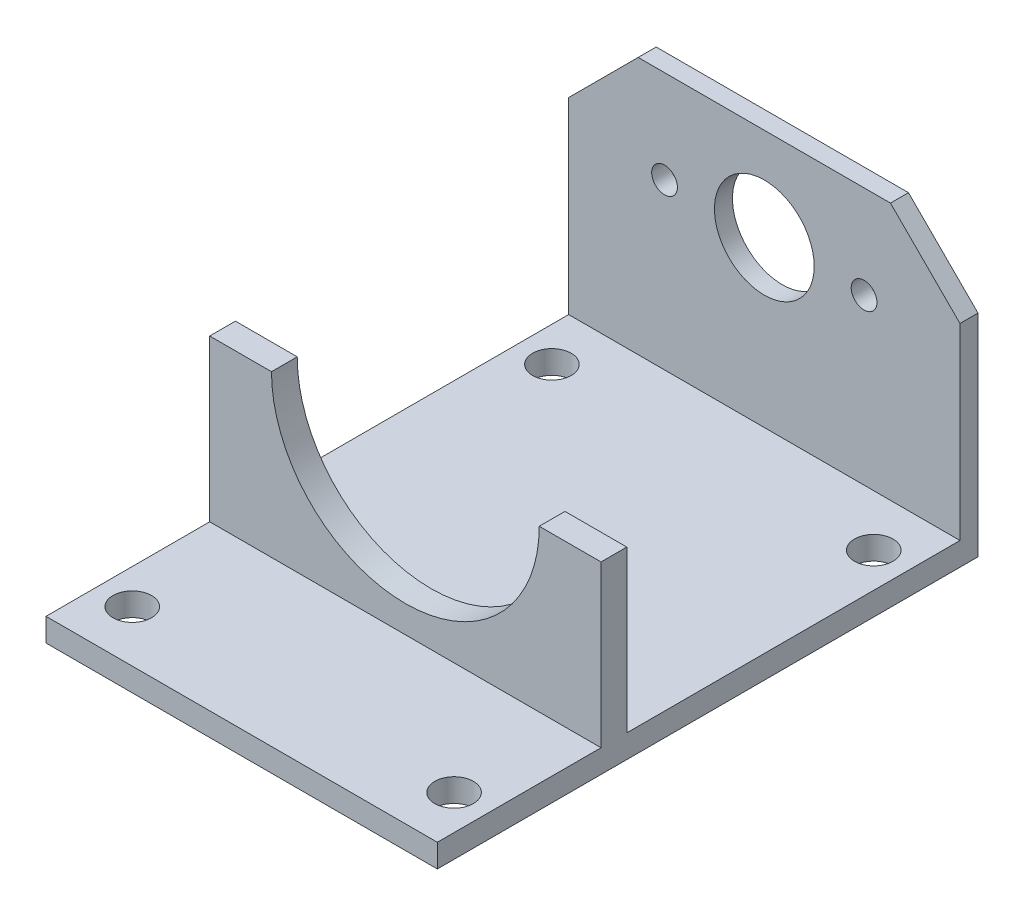
ISO-10303-21;
HEADER;
FILE_DESCRIPTION(('STEP AP214'),'2;1');
FILE_NAME('part.step','',(''),(''),'','','');
FILE_SCHEMA(('AUTOMOTIVE_DESIGN { 1 0 10303 214 1 1 1 1 }'));
ENDSEC;
DATA;
#1=APPLICATION_CONTEXT('core data for automotive mechanical design processes');
#2=APPLICATION_PROTOCOL_DEFINITION('international standard','automotive_design',2000,#1);
#3=PRODUCT_CONTEXT('',#1,'mechanical');
#4=PRODUCT('Part','Part','',(#3));
#5=PRODUCT_RELATED_PRODUCT_CATEGORY('part','',(#4));
#6=PRODUCT_DEFINITION_FORMATION('','',#4);
#7=PRODUCT_DEFINITION_CONTEXT('part definition',#1,'design');
#8=PRODUCT_DEFINITION('design','',#6,#7);
#9=PRODUCT_DEFINITION_SHAPE('','',#8);
#10=(LENGTH_UNIT() NAMED_UNIT(*) SI_UNIT(.MILLI.,.METRE.));
#11=(NAMED_UNIT(*) PLANE_ANGLE_UNIT() SI_UNIT($,.RADIAN.));
#12=(NAMED_UNIT(*) SI_UNIT($,.STERADIAN.) SOLID_ANGLE_UNIT());
#13=UNCERTAINTY_MEASURE_WITH_UNIT(LENGTH_MEASURE(1.E-05),#10,'distance_accuracy_value','');
#14=(GEOMETRIC_REPRESENTATION_CONTEXT(3) GLOBAL_UNCERTAINTY_ASSIGNED_CONTEXT((#13)) GLOBAL_UNIT_ASSIGNED_CONTEXT((#10,
#11,#12)) REPRESENTATION_CONTEXT('',''));
#15=CARTESIAN_POINT('',(0.,0.,0.));
#16=DIRECTION('',(0.,0.,1.));
#17=DIRECTION('',(1.,0.,0.));
#18=AXIS2_PLACEMENT_3D('',#15,#16,#17);
#19=CARTESIAN_POINT('',(0.,14.3,0.));
#20=DIRECTION('',(0.,1.,0.));
#21=DIRECTION('',(0.,0.,1.));
#22=AXIS2_PLACEMENT_3D('',#19,#20,#21);
#23=PLANE('',#22);
#24=DIRECTION('',(0.,0.,1.));
#25=VECTOR('',#24,1.);
#26=CARTESIAN_POINT('',(-10.4,14.3,-1.71625303385541));
#27=LINE('',#26,#25);
#28=CARTESIAN_POINT('',(-10.4,14.3,6.28374696614459));
#29=VERTEX_POINT('',#28);
#30=CARTESIAN_POINT('',(-10.4,14.3,8.28374696614459));
#31=VERTEX_POINT('',#30);
#32=EDGE_CURVE('E11',#29,#31,#27,.T.);
#33=ORIENTED_EDGE('',*,*,#32,.F.);
#34=DIRECTION('',(-1.,0.,0.));
#35=VECTOR('',#34,1.);
#36=CARTESIAN_POINT('',(15.2,14.3,6.28374696614459));
#37=LINE('',#36,#35);
#38=CARTESIAN_POINT('',(-15.2,14.3,6.28374696614459));
#39=VERTEX_POINT('',#38);
#40=EDGE_CURVE('E274',#29,#39,#37,.T.);
#41=ORIENTED_EDGE('',*,*,#40,.T.);
#42=DIRECTION('',(0.,0.,1.));
#43=VECTOR('',#42,1.);
#44=CARTESIAN_POINT('',(-15.2,14.3,8.28374696614459));
#45=LINE('',#44,#43);
#46=CARTESIAN_POINT('',(-15.2,14.3,8.28374696614459));
#47=VERTEX_POINT('',#46);
#48=EDGE_CURVE('E144',#39,#47,#45,.T.);
#49=ORIENTED_EDGE('',*,*,#48,.T.);
#50=DIRECTION('',(1.,0.,0.));
#51=VECTOR('',#50,1.);
#52=CARTESIAN_POINT('',(15.2,14.3,8.28374696614459));
#53=LINE('',#52,#51);
#54=EDGE_CURVE('E139',#47,#31,#53,.T.);
#55=ORIENTED_EDGE('',*,*,#54,.T.);
#56=EDGE_LOOP('',(#33,#41,#49,#55));
#57=FACE_BOUND('',#56,.T.);
#58=ADVANCED_FACE('F32',(#57),#23,.T.);
#59=CARTESIAN_POINT('',(0.,1.8,0.));
#60=DIRECTION('',(0.,1.,0.));
#61=DIRECTION('',(0.,0.,1.));
#62=AXIS2_PLACEMENT_3D('',#59,#60,#61);
#63=PLANE('',#62);
#64=CARTESIAN_POINT('',(-12.5,1.8,-15.6));
#65=DIRECTION('',(0.,1.,0.));
#66=DIRECTION('',(0.,0.,1.));
#67=AXIS2_PLACEMENT_3D('',#64,#65,#66);
#68=CIRCLE('',#67,1.5);
#69=CARTESIAN_POINT('',(-12.5,1.8,-14.1));
#70=VERTEX_POINT('',#69);
#71=EDGE_CURVE('E197',#70,#70,#68,.T.);
#72=ORIENTED_EDGE('',*,*,#71,.F.);
#73=EDGE_LOOP('',(#72));
#74=FACE_BOUND('',#73,.T.);
#75=CARTESIAN_POINT('',(12.5,1.8,-15.6));
#76=DIRECTION('',(0.,1.,0.));
#77=DIRECTION('',(0.,0.,1.));
#78=AXIS2_PLACEMENT_3D('',#75,#76,#77);
#79=CIRCLE('',#78,1.5);
#80=CARTESIAN_POINT('',(12.5,1.8,-14.1));
#81=VERTEX_POINT('',#80);
#82=EDGE_CURVE('E200',#81,#81,#79,.T.);
#83=ORIENTED_EDGE('',*,*,#82,.F.);
#84=EDGE_LOOP('',(#83));
#85=FACE_BOUND('',#84,.T.);
#86=DIRECTION('',(0.,0.,1.));
#87=VECTOR('',#86,1.);
#88=CARTESIAN_POINT('',(-15.2,1.8,-21.));
#89=LINE('',#88,#87);
#90=CARTESIAN_POINT('',(-15.2,1.8,-19.6));
#91=VERTEX_POINT('',#90);
#92=CARTESIAN_POINT('',(-15.2,1.8,6.28374696614459));
#93=VERTEX_POINT('',#92);
#94=EDGE_CURVE('E230',#91,#93,#89,.T.);
#95=ORIENTED_EDGE('',*,*,#94,.T.);
#96=DIRECTION('',(-1.,0.,0.));
#97=VECTOR('',#96,1.);
#98=CARTESIAN_POINT('',(15.2,1.8,6.28374696614459));
#99=LINE('',#98,#97);
#100=CARTESIAN_POINT('',(15.2,1.8,6.28374696614459));
#101=VERTEX_POINT('',#100);
#102=EDGE_CURVE('E152',#101,#93,#99,.T.);
#103=ORIENTED_EDGE('',*,*,#102,.F.);
#104=DIRECTION('',(0.,0.,-1.));
#105=VECTOR('',#104,1.);
#106=CARTESIAN_POINT('',(15.2,1.8,-21.));
#107=LINE('',#106,#105);
#108=CARTESIAN_POINT('',(15.2,1.8,-19.6));
#109=VERTEX_POINT('',#108);
#110=EDGE_CURVE('E229',#101,#109,#107,.T.);
#111=ORIENTED_EDGE('',*,*,#110,.T.);
#112=DIRECTION('',(1.,0.,0.));
#113=VECTOR('',#112,1.);
#114=CARTESIAN_POINT('',(-15.2,1.8,-19.6));
#115=LINE('',#114,#113);
#116=EDGE_CURVE('E215',#91,#109,#115,.T.);
#117=ORIENTED_EDGE('',*,*,#116,.F.);
#118=EDGE_LOOP('',(#95,#103,#111,#117));
#119=FACE_BOUND('',#118,.T.);
#120=ADVANCED_FACE('F296',(#74,#85,#119),#63,.T.);
#121=CARTESIAN_POINT('',(-12.5,1.8,17.));
#122=DIRECTION('',(0.,1.,0.));
#123=DIRECTION('',(0.,0.,1.));
#124=AXIS2_PLACEMENT_3D('',#121,#122,#123);
#125=CIRCLE('',#124,1.5);
#126=CARTESIAN_POINT('',(-12.5,1.8,18.5));
#127=VERTEX_POINT('',#126);
#128=EDGE_CURVE('E206',#127,#127,#125,.T.);
#129=ORIENTED_EDGE('',*,*,#128,.F.);
#130=EDGE_LOOP('',(#129));
#131=FACE_BOUND('',#130,.T.);
#132=CARTESIAN_POINT('',(12.5,1.8,17.));
#133=DIRECTION('',(0.,1.,0.));
#134=DIRECTION('',(0.,0.,1.));
#135=AXIS2_PLACEMENT_3D('',#132,#133,#134);
#136=CIRCLE('',#135,1.5);
#137=CARTESIAN_POINT('',(12.5,1.8,18.5));
#138=VERTEX_POINT('',#137);
#139=EDGE_CURVE('E196',#138,#138,#136,.T.);
#140=ORIENTED_EDGE('',*,*,#139,.F.);
#141=EDGE_LOOP('',(#140));
#142=FACE_BOUND('',#141,.T.);
#143=CARTESIAN_POINT('',(15.2,1.8,21.));
#144=VERTEX_POINT('',#143);
#145=CARTESIAN_POINT('',(15.2,1.8,8.28374696614459));
#146=VERTEX_POINT('',#145);
#147=EDGE_CURVE('E225',#144,#146,#107,.T.);
#148=ORIENTED_EDGE('',*,*,#147,.T.);
#149=DIRECTION('',(1.,0.,0.));
#150=VECTOR('',#149,1.);
#151=CARTESIAN_POINT('',(15.2,1.8,8.28374696614459));
#152=LINE('',#151,#150);
#153=CARTESIAN_POINT('',(-15.2,1.8,8.28374696614458));
#154=VERTEX_POINT('',#153);
#155=EDGE_CURVE('E154',#154,#146,#152,.T.);
#156=ORIENTED_EDGE('',*,*,#155,.F.);
#157=CARTESIAN_POINT('',(-15.2,1.8,21.));
#158=VERTEX_POINT('',#157);
#159=EDGE_CURVE('E228',#154,#158,#89,.T.);
#160=ORIENTED_EDGE('',*,*,#159,.T.);
#161=DIRECTION('',(1.,0.,0.));
#162=VECTOR('',#161,1.);
#163=CARTESIAN_POINT('',(-15.2,1.8,21.));
#164=LINE('',#163,#162);
#165=EDGE_CURVE('E233',#158,#144,#164,.T.);
#166=ORIENTED_EDGE('',*,*,#165,.T.);
#167=EDGE_LOOP('',(#148,#156,#160,#166));
#168=FACE_BOUND('',#167,.T.);
#169=ADVANCED_FACE('F289',(#131,#142,#168),#63,.T.);
#170=CARTESIAN_POINT('',(15.2,1.8,-21.));
#171=DIRECTION('',(-1.,0.,0.));
#172=DIRECTION('',(0.,0.,1.));
#173=AXIS2_PLACEMENT_3D('',#170,#171,#172);
#174=PLANE('',#173);
#175=DIRECTION('',(0.,-1.,0.));
#176=VECTOR('',#175,1.);
#177=CARTESIAN_POINT('',(15.2,1.8,-21.));
#178=LINE('',#177,#176);
#179=CARTESIAN_POINT('',(15.2,16.4,-21.));
#180=VERTEX_POINT('',#179);
#181=CARTESIAN_POINT('',(15.2,0.,-21.));
#182=VERTEX_POINT('',#181);
#183=EDGE_CURVE('E252',#180,#182,#178,.T.);
#184=ORIENTED_EDGE('',*,*,#183,.F.);
#185=DIRECTION('',(0.,0.,1.));
#186=VECTOR('',#185,1.);
#187=CARTESIAN_POINT('',(15.2,16.4,-39.6));
#188=LINE('',#187,#186);
#189=CARTESIAN_POINT('',(15.2,16.4,-19.6));
#190=VERTEX_POINT('',#189);
#191=EDGE_CURVE('E172',#180,#190,#188,.T.);
#192=ORIENTED_EDGE('',*,*,#191,.T.);
#193=DIRECTION('',(0.,-1.,0.));
#194=VECTOR('',#193,1.);
#195=CARTESIAN_POINT('',(15.2,21.8,-19.6));
#196=LINE('',#195,#194);
#197=EDGE_CURVE('E217',#190,#109,#196,.T.);
#198=ORIENTED_EDGE('',*,*,#197,.T.);
#199=ORIENTED_EDGE('',*,*,#110,.F.);
#200=DIRECTION('',(0.,-1.,0.));
#201=VECTOR('',#200,1.);
#202=CARTESIAN_POINT('',(15.2,14.3,6.28374696614459));
#203=LINE('',#202,#201);
#204=CARTESIAN_POINT('',(15.2,14.3,6.28374696614459));
#205=VERTEX_POINT('',#204);
#206=EDGE_CURVE('E161',#205,#101,#203,.T.);
#207=ORIENTED_EDGE('',*,*,#206,.F.);
#208=DIRECTION('',(0.,0.,-1.));
#209=VECTOR('',#208,1.);
#210=CARTESIAN_POINT('',(15.2,14.3,8.28374696614459));
#211=LINE('',#210,#209);
#212=CARTESIAN_POINT('',(15.2,14.3,8.28374696614459));
#213=VERTEX_POINT('',#212);
#214=EDGE_CURVE('E155',#213,#205,#211,.T.);
#215=ORIENTED_EDGE('',*,*,#214,.F.);
#216=DIRECTION('',(0.,-1.,0.));
#217=VECTOR('',#216,1.);
#218=CARTESIAN_POINT('',(15.2,14.3,8.28374696614459));
#219=LINE('',#218,#217);
#220=EDGE_CURVE('E145',#213,#146,#219,.T.);
#221=ORIENTED_EDGE('',*,*,#220,.T.);
#222=ORIENTED_EDGE('',*,*,#147,.F.);
#223=DIRECTION('',(0.,-1.,0.));
#224=VECTOR('',#223,1.);
#225=CARTESIAN_POINT('',(15.2,1.8,21.));
#226=LINE('',#225,#224);
#227=CARTESIAN_POINT('',(15.2,0.,21.));
#228=VERTEX_POINT('',#227);
#229=EDGE_CURVE('E235',#144,#228,#226,.T.);
#230=ORIENTED_EDGE('',*,*,#229,.T.);
#231=DIRECTION('',(0.,0.,-1.));
#232=VECTOR('',#231,1.);
#233=CARTESIAN_POINT('',(15.2,0.,-21.));
#234=LINE('',#233,#232);
#235=EDGE_CURVE('E224',#228,#182,#234,.T.);
#236=ORIENTED_EDGE('',*,*,#235,.T.);
#237=EDGE_LOOP('',(#184,#192,#198,#199,#207,#215,#221,#222,#230,#236));
#238=FACE_BOUND('',#237,.T.);
#239=ADVANCED_FACE('F34',(#238),#174,.F.);
#240=CARTESIAN_POINT('',(-15.2,1.8,-21.));
#241=DIRECTION('',(0.,0.,1.));
#242=DIRECTION('',(1.,0.,0.));
#243=AXIS2_PLACEMENT_3D('',#240,#241,#242);
#244=PLANE('',#243);
#245=CARTESIAN_POINT('',(7.75,14.58,-21.));
#246=DIRECTION('',(0.,0.,1.));
#247=DIRECTION('',(1.,0.,0.));
#248=AXIS2_PLACEMENT_3D('',#245,#246,#247);
#249=CIRCLE('',#248,1.);
#250=CARTESIAN_POINT('',(8.75,14.58,-21.));
#251=VERTEX_POINT('',#250);
#252=EDGE_CURVE('E186',#251,#251,#249,.T.);
#253=ORIENTED_EDGE('',*,*,#252,.T.);
#254=EDGE_LOOP('',(#253));
#255=FACE_BOUND('',#254,.T.);
#256=CARTESIAN_POINT('',(-7.75,14.58,-21.));
#257=DIRECTION('',(0.,0.,1.));
#258=DIRECTION('',(1.,0.,0.));
#259=AXIS2_PLACEMENT_3D('',#256,#257,#258);
#260=CIRCLE('',#259,1.);
#261=CARTESIAN_POINT('',(-6.75,14.58,-21.));
#262=VERTEX_POINT('',#261);
#263=EDGE_CURVE('E183',#262,#262,#260,.T.);
#264=ORIENTED_EDGE('',*,*,#263,.T.);
#265=EDGE_LOOP('',(#264));
#266=FACE_BOUND('',#265,.T.);
#267=CARTESIAN_POINT('',(0.,14.58,-21.));
#268=DIRECTION('',(0.,0.,1.));
#269=DIRECTION('',(1.,0.,0.));
#270=AXIS2_PLACEMENT_3D('',#267,#268,#269);
#271=CIRCLE('',#270,3.875);
#272=CARTESIAN_POINT('',(3.875,14.58,-21.));
#273=VERTEX_POINT('',#272);
#274=EDGE_CURVE('E180',#273,#273,#271,.T.);
#275=ORIENTED_EDGE('',*,*,#274,.T.);
#276=EDGE_LOOP('',(#275));
#277=FACE_BOUND('',#276,.T.);
#278=DIRECTION('',(-1.,0.,0.));
#279=VECTOR('',#278,1.);
#280=CARTESIAN_POINT('',(-15.2,21.8,-21.));
#281=LINE('',#280,#279);
#282=CARTESIAN_POINT('',(9.8,21.8,-21.));
#283=VERTEX_POINT('',#282);
#284=CARTESIAN_POINT('',(-9.8,21.8,-21.));
#285=VERTEX_POINT('',#284);
#286=EDGE_CURVE('E214',#283,#285,#281,.T.);
#287=ORIENTED_EDGE('',*,*,#286,.F.);
#288=DIRECTION('',(0.707106781186547,-0.707106781186548,0.));
#289=VECTOR('',#288,1.);
#290=CARTESIAN_POINT('',(7.3,24.3,-21.));
#291=LINE('',#290,#289);
#292=EDGE_CURVE('E175',#283,#180,#291,.T.);
#293=ORIENTED_EDGE('',*,*,#292,.T.);
#294=ORIENTED_EDGE('',*,*,#183,.T.);
#295=DIRECTION('',(-1.,0.,0.));
#296=VECTOR('',#295,1.);
#297=CARTESIAN_POINT('',(-15.2,0.,-21.));
#298=LINE('',#297,#296);
#299=CARTESIAN_POINT('',(-15.2,0.,-21.));
#300=VERTEX_POINT('',#299);
#301=EDGE_CURVE('E238',#182,#300,#298,.T.);
#302=ORIENTED_EDGE('',*,*,#301,.T.);
#303=DIRECTION('',(0.,-1.,0.));
#304=VECTOR('',#303,1.);
#305=CARTESIAN_POINT('',(-15.2,1.8,-21.));
#306=LINE('',#305,#304);
#307=CARTESIAN_POINT('',(-15.2,16.4,-21.));
#308=VERTEX_POINT('',#307);
#309=EDGE_CURVE('E250',#308,#300,#306,.T.);
#310=ORIENTED_EDGE('',*,*,#309,.F.);
#311=DIRECTION('',(0.707106781186547,0.707106781186548,0.));
#312=VECTOR('',#311,1.);
#313=CARTESIAN_POINT('',(-22.5,9.1,-21.));
#314=LINE('',#313,#312);
#315=EDGE_CURVE('E193',#308,#285,#314,.T.);
#316=ORIENTED_EDGE('',*,*,#315,.T.);
#317=EDGE_LOOP('',(#287,#293,#294,#302,#310,#316));
#318=FACE_BOUND('',#317,.T.);
#319=ADVANCED_FACE('F314',(#255,#266,#277,#318),#244,.F.);
#320=CARTESIAN_POINT('',(-15.2,1.8,-21.));
#321=DIRECTION('',(1.,0.,0.));
#322=DIRECTION('',(0.,0.,-1.));
#323=AXIS2_PLACEMENT_3D('',#320,#321,#322);
#324=PLANE('',#323);
#325=DIRECTION('',(0.,-1.,0.));
#326=VECTOR('',#325,1.);
#327=CARTESIAN_POINT('',(-15.2,21.8,-19.6));
#328=LINE('',#327,#326);
#329=CARTESIAN_POINT('',(-15.2,16.4,-19.6));
#330=VERTEX_POINT('',#329);
#331=EDGE_CURVE('E222',#330,#91,#328,.T.);
#332=ORIENTED_EDGE('',*,*,#331,.F.);
#333=DIRECTION('',(0.,0.,1.));
#334=VECTOR('',#333,1.);
#335=CARTESIAN_POINT('',(-15.2,16.4,-39.6));
#336=LINE('',#335,#334);
#337=EDGE_CURVE('E191',#308,#330,#336,.T.);
#338=ORIENTED_EDGE('',*,*,#337,.F.);
#339=ORIENTED_EDGE('',*,*,#309,.T.);
#340=DIRECTION('',(0.,0.,1.));
#341=VECTOR('',#340,1.);
#342=CARTESIAN_POINT('',(-15.2,0.,-21.));
#343=LINE('',#342,#341);
#344=CARTESIAN_POINT('',(-15.2,0.,21.));
#345=VERTEX_POINT('',#344);
#346=EDGE_CURVE('E241',#300,#345,#343,.T.);
#347=ORIENTED_EDGE('',*,*,#346,.T.);
#348=DIRECTION('',(0.,-1.,0.));
#349=VECTOR('',#348,1.);
#350=CARTESIAN_POINT('',(-15.2,1.8,21.));
#351=LINE('',#350,#349);
#352=EDGE_CURVE('E247',#158,#345,#351,.T.);
#353=ORIENTED_EDGE('',*,*,#352,.F.);
#354=ORIENTED_EDGE('',*,*,#159,.F.);
#355=DIRECTION('',(0.,-1.,0.));
#356=VECTOR('',#355,1.);
#357=CARTESIAN_POINT('',(-15.2,14.3,8.28374696614459));
#358=LINE('',#357,#356);
#359=EDGE_CURVE('E54',#47,#154,#358,.T.);
#360=ORIENTED_EDGE('',*,*,#359,.F.);
#361=ORIENTED_EDGE('',*,*,#48,.F.);
#362=DIRECTION('',(0.,-1.,0.));
#363=VECTOR('',#362,1.);
#364=CARTESIAN_POINT('',(-15.2,14.3,6.28374696614459));
#365=LINE('',#364,#363);
#366=EDGE_CURVE('E158',#39,#93,#365,.T.);
#367=ORIENTED_EDGE('',*,*,#366,.T.);
#368=ORIENTED_EDGE('',*,*,#94,.F.);
#369=EDGE_LOOP('',(#332,#338,#339,#347,#353,#354,#360,#361,#367,#368));
#370=FACE_BOUND('',#369,.T.);
#371=ADVANCED_FACE('F284',(#370),#324,.F.);
#372=CARTESIAN_POINT('',(-15.2,1.8,21.));
#373=DIRECTION('',(0.,0.,-1.));
#374=DIRECTION('',(-1.,0.,0.));
#375=AXIS2_PLACEMENT_3D('',#372,#373,#374);
#376=PLANE('',#375);
#377=DIRECTION('',(1.,0.,0.));
#378=VECTOR('',#377,1.);
#379=CARTESIAN_POINT('',(-15.2,0.,21.));
#380=LINE('',#379,#378);
#381=EDGE_CURVE('E243',#345,#228,#380,.T.);
#382=ORIENTED_EDGE('',*,*,#381,.T.);
#383=ORIENTED_EDGE('',*,*,#229,.F.);
#384=ORIENTED_EDGE('',*,*,#165,.F.);
#385=ORIENTED_EDGE('',*,*,#352,.T.);
#386=EDGE_LOOP('',(#382,#383,#384,#385));
#387=FACE_BOUND('',#386,.T.);
#388=ADVANCED_FACE('F320',(#387),#376,.F.);
#389=CARTESIAN_POINT('',(0.,0.,0.));
#390=DIRECTION('',(0.,1.,0.));
#391=DIRECTION('',(0.,0.,1.));
#392=AXIS2_PLACEMENT_3D('',#389,#390,#391);
#393=PLANE('',#392);
#394=CARTESIAN_POINT('',(12.5,0.,17.));
#395=DIRECTION('',(0.,1.,0.));
#396=DIRECTION('',(0.,0.,1.));
#397=AXIS2_PLACEMENT_3D('',#394,#395,#396);
#398=CIRCLE('',#397,1.5);
#399=CARTESIAN_POINT('',(12.5,0.,18.5));
#400=VERTEX_POINT('',#399);
#401=EDGE_CURVE('E210',#400,#400,#398,.T.);
#402=ORIENTED_EDGE('',*,*,#401,.T.);
#403=EDGE_LOOP('',(#402));
#404=FACE_BOUND('',#403,.T.);
#405=CARTESIAN_POINT('',(-12.5,0.,-15.6));
#406=DIRECTION('',(0.,1.,0.));
#407=DIRECTION('',(0.,0.,1.));
#408=AXIS2_PLACEMENT_3D('',#405,#406,#407);
#409=CIRCLE('',#408,1.5);
#410=CARTESIAN_POINT('',(-12.5,0.,-14.1));
#411=VERTEX_POINT('',#410);
#412=EDGE_CURVE('E259',#411,#411,#409,.T.);
#413=ORIENTED_EDGE('',*,*,#412,.T.);
#414=EDGE_LOOP('',(#413));
#415=FACE_BOUND('',#414,.T.);
#416=CARTESIAN_POINT('',(12.5,0.,-15.6));
#417=DIRECTION('',(0.,1.,0.));
#418=DIRECTION('',(0.,0.,1.));
#419=AXIS2_PLACEMENT_3D('',#416,#417,#418);
#420=CIRCLE('',#419,1.5);
#421=CARTESIAN_POINT('',(12.5,0.,-14.1));
#422=VERTEX_POINT('',#421);
#423=EDGE_CURVE('E205',#422,#422,#420,.T.);
#424=ORIENTED_EDGE('',*,*,#423,.T.);
#425=EDGE_LOOP('',(#424));
#426=FACE_BOUND('',#425,.T.);
#427=CARTESIAN_POINT('',(-12.5,0.,17.));
#428=DIRECTION('',(0.,1.,0.));
#429=DIRECTION('',(0.,0.,1.));
#430=AXIS2_PLACEMENT_3D('',#427,#428,#429);
#431=CIRCLE('',#430,1.5);
#432=CARTESIAN_POINT('',(-12.5,0.,18.5));
#433=VERTEX_POINT('',#432);
#434=EDGE_CURVE('E209',#433,#433,#431,.T.);
#435=ORIENTED_EDGE('',*,*,#434,.T.);
#436=EDGE_LOOP('',(#435));
#437=FACE_BOUND('',#436,.T.);
#438=ORIENTED_EDGE('',*,*,#235,.F.);
#439=ORIENTED_EDGE('',*,*,#381,.F.);
#440=ORIENTED_EDGE('',*,*,#346,.F.);
#441=ORIENTED_EDGE('',*,*,#301,.F.);
#442=EDGE_LOOP('',(#438,#439,#440,#441));
#443=FACE_BOUND('',#442,.T.);
#444=ADVANCED_FACE('F322',(#404,#415,#426,#437,#443),#393,.F.);
#445=CARTESIAN_POINT('',(-15.2,21.8,-19.6));
#446=DIRECTION('',(0.,0.,-1.));
#447=DIRECTION('',(-1.,0.,0.));
#448=AXIS2_PLACEMENT_3D('',#445,#446,#447);
#449=PLANE('',#448);
#450=CARTESIAN_POINT('',(7.75,14.58,-19.6));
#451=DIRECTION('',(0.,0.,1.));
#452=DIRECTION('',(1.,0.,0.));
#453=AXIS2_PLACEMENT_3D('',#450,#451,#452);
#454=CIRCLE('',#453,1.);
#455=CARTESIAN_POINT('',(8.75,14.58,-19.6));
#456=VERTEX_POINT('',#455);
#457=EDGE_CURVE('E163',#456,#456,#454,.T.);
#458=ORIENTED_EDGE('',*,*,#457,.F.);
#459=EDGE_LOOP('',(#458));
#460=FACE_BOUND('',#459,.T.);
#461=CARTESIAN_POINT('',(-7.75,14.58,-19.6));
#462=DIRECTION('',(0.,0.,1.));
#463=DIRECTION('',(1.,0.,0.));
#464=AXIS2_PLACEMENT_3D('',#461,#462,#463);
#465=CIRCLE('',#464,1.);
#466=CARTESIAN_POINT('',(-6.75,14.58,-19.6));
#467=VERTEX_POINT('',#466);
#468=EDGE_CURVE('E164',#467,#467,#465,.T.);
#469=ORIENTED_EDGE('',*,*,#468,.F.);
#470=EDGE_LOOP('',(#469));
#471=FACE_BOUND('',#470,.T.);
#472=CARTESIAN_POINT('',(0.,14.58,-19.6));
#473=DIRECTION('',(0.,0.,1.));
#474=DIRECTION('',(1.,0.,0.));
#475=AXIS2_PLACEMENT_3D('',#472,#473,#474);
#476=CIRCLE('',#475,3.875);
#477=CARTESIAN_POINT('',(3.875,14.58,-19.6));
#478=VERTEX_POINT('',#477);
#479=EDGE_CURVE('E167',#478,#478,#476,.T.);
#480=ORIENTED_EDGE('',*,*,#479,.F.);
#481=EDGE_LOOP('',(#480));
#482=FACE_BOUND('',#481,.T.);
#483=ORIENTED_EDGE('',*,*,#197,.F.);
#484=DIRECTION('',(0.707106781186547,-0.707106781186548,0.));
#485=VECTOR('',#484,1.);
#486=CARTESIAN_POINT('',(9.8,21.8,-19.6));
#487=LINE('',#486,#485);
#488=CARTESIAN_POINT('',(9.8,21.8,-19.6));
#489=VERTEX_POINT('',#488);
#490=EDGE_CURVE('E170',#489,#190,#487,.T.);
#491=ORIENTED_EDGE('',*,*,#490,.F.);
#492=DIRECTION('',(1.,0.,0.));
#493=VECTOR('',#492,1.);
#494=CARTESIAN_POINT('',(-15.2,21.8,-19.6));
#495=LINE('',#494,#493);
#496=CARTESIAN_POINT('',(-9.8,21.8,-19.6));
#497=VERTEX_POINT('',#496);
#498=EDGE_CURVE('E211',#497,#489,#495,.T.);
#499=ORIENTED_EDGE('',*,*,#498,.F.);
#500=DIRECTION('',(0.707106781186547,0.707106781186548,0.));
#501=VECTOR('',#500,1.);
#502=CARTESIAN_POINT('',(-15.2,16.4,-19.6));
#503=LINE('',#502,#501);
#504=EDGE_CURVE('E189',#330,#497,#503,.T.);
#505=ORIENTED_EDGE('',*,*,#504,.F.);
#506=ORIENTED_EDGE('',*,*,#331,.T.);
#507=ORIENTED_EDGE('',*,*,#116,.T.);
#508=EDGE_LOOP('',(#483,#491,#499,#505,#506,#507));
#509=FACE_BOUND('',#508,.T.);
#510=ADVANCED_FACE('F303',(#460,#471,#482,#509),#449,.F.);
#511=CARTESIAN_POINT('',(0.,21.8,0.));
#512=DIRECTION('',(0.,1.,0.));
#513=DIRECTION('',(0.,0.,1.));
#514=AXIS2_PLACEMENT_3D('',#511,#512,#513);
#515=PLANE('',#514);
#516=DIRECTION('',(0.,0.,1.));
#517=VECTOR('',#516,1.);
#518=CARTESIAN_POINT('',(9.8,21.8,0.));
#519=LINE('',#518,#517);
#520=EDGE_CURVE('E266',#283,#489,#519,.T.);
#521=ORIENTED_EDGE('',*,*,#520,.F.);
#522=ORIENTED_EDGE('',*,*,#286,.T.);
#523=DIRECTION('',(0.,0.,-1.));
#524=VECTOR('',#523,1.);
#525=CARTESIAN_POINT('',(-9.8,21.8,0.));
#526=LINE('',#525,#524);
#527=EDGE_CURVE('E254',#497,#285,#526,.T.);
#528=ORIENTED_EDGE('',*,*,#527,.F.);
#529=ORIENTED_EDGE('',*,*,#498,.T.);
#530=EDGE_LOOP('',(#521,#522,#528,#529));
#531=FACE_BOUND('',#530,.T.);
#532=ADVANCED_FACE('F311',(#531),#515,.T.);
#533=CARTESIAN_POINT('',(-12.5,-18.2,17.));
#534=DIRECTION('',(0.,1.,0.));
#535=DIRECTION('',(0.,0.,1.));
#536=AXIS2_PLACEMENT_3D('',#533,#534,#535);
#537=CYLINDRICAL_SURFACE('',#536,1.5);
#538=ORIENTED_EDGE('',*,*,#128,.T.);
#539=EDGE_LOOP('',(#538));
#540=FACE_BOUND('',#539,.T.);
#541=ORIENTED_EDGE('',*,*,#434,.F.);
#542=EDGE_LOOP('',(#541));
#543=FACE_BOUND('',#542,.T.);
#544=ADVANCED_FACE('F391',(#540,#543),#537,.F.);
#545=CARTESIAN_POINT('',(12.5,-18.2,-15.6));
#546=DIRECTION('',(0.,1.,0.));
#547=DIRECTION('',(0.,0.,1.));
#548=AXIS2_PLACEMENT_3D('',#545,#546,#547);
#549=CYLINDRICAL_SURFACE('',#548,1.5);
#550=ORIENTED_EDGE('',*,*,#82,.T.);
#551=EDGE_LOOP('',(#550));
#552=FACE_BOUND('',#551,.T.);
#553=ORIENTED_EDGE('',*,*,#423,.F.);
#554=EDGE_LOOP('',(#553));
#555=FACE_BOUND('',#554,.T.);
#556=ADVANCED_FACE('F394',(#552,#555),#549,.F.);
#557=CARTESIAN_POINT('',(-12.5,-18.2,-15.6));
#558=DIRECTION('',(0.,1.,0.));
#559=DIRECTION('',(0.,0.,1.));
#560=AXIS2_PLACEMENT_3D('',#557,#558,#559);
#561=CYLINDRICAL_SURFACE('',#560,1.5);
#562=ORIENTED_EDGE('',*,*,#71,.T.);
#563=EDGE_LOOP('',(#562));
#564=FACE_BOUND('',#563,.T.);
#565=ORIENTED_EDGE('',*,*,#412,.F.);
#566=EDGE_LOOP('',(#565));
#567=FACE_BOUND('',#566,.T.);
#568=ADVANCED_FACE('F398',(#564,#567),#561,.F.);
#569=CARTESIAN_POINT('',(12.5,-18.2,17.));
#570=DIRECTION('',(0.,1.,0.));
#571=DIRECTION('',(0.,0.,1.));
#572=AXIS2_PLACEMENT_3D('',#569,#570,#571);
#573=CYLINDRICAL_SURFACE('',#572,1.5);
#574=ORIENTED_EDGE('',*,*,#139,.T.);
#575=EDGE_LOOP('',(#574));
#576=FACE_BOUND('',#575,.T.);
#577=ORIENTED_EDGE('',*,*,#401,.F.);
#578=EDGE_LOOP('',(#577));
#579=FACE_BOUND('',#578,.T.);
#580=ADVANCED_FACE('F335',(#576,#579),#573,.F.);
#581=CARTESIAN_POINT('',(-15.2,16.4,-39.6));
#582=DIRECTION('',(0.707106781186548,-0.707106781186547,0.));
#583=DIRECTION('',(0.707106781186547,0.707106781186548,0.));
#584=AXIS2_PLACEMENT_3D('',#581,#582,#583);
#585=PLANE('',#584);
#586=ORIENTED_EDGE('',*,*,#337,.T.);
#587=ORIENTED_EDGE('',*,*,#504,.T.);
#588=ORIENTED_EDGE('',*,*,#527,.T.);
#589=ORIENTED_EDGE('',*,*,#315,.F.);
#590=EDGE_LOOP('',(#586,#587,#588,#589));
#591=FACE_BOUND('',#590,.T.);
#592=ADVANCED_FACE('F308',(#591),#585,.F.);
#593=CARTESIAN_POINT('',(9.8,21.8,-39.6));
#594=DIRECTION('',(-0.707106781186548,-0.707106781186547,0.));
#595=DIRECTION('',(0.707106781186547,-0.707106781186548,0.));
#596=AXIS2_PLACEMENT_3D('',#593,#594,#595);
#597=PLANE('',#596);
#598=ORIENTED_EDGE('',*,*,#520,.T.);
#599=ORIENTED_EDGE('',*,*,#490,.T.);
#600=ORIENTED_EDGE('',*,*,#191,.F.);
#601=ORIENTED_EDGE('',*,*,#292,.F.);
#602=EDGE_LOOP('',(#598,#599,#600,#601));
#603=FACE_BOUND('',#602,.T.);
#604=ADVANCED_FACE('F324',(#603),#597,.F.);
#605=CARTESIAN_POINT('',(0.,14.58,-39.6));
#606=DIRECTION('',(0.,0.,1.));
#607=DIRECTION('',(1.,0.,0.));
#608=AXIS2_PLACEMENT_3D('',#605,#606,#607);
#609=CYLINDRICAL_SURFACE('',#608,3.875);
#610=ORIENTED_EDGE('',*,*,#479,.T.);
#611=EDGE_LOOP('',(#610));
#612=FACE_BOUND('',#611,.T.);
#613=ORIENTED_EDGE('',*,*,#274,.F.);
#614=EDGE_LOOP('',(#613));
#615=FACE_BOUND('',#614,.T.);
#616=ADVANCED_FACE('F326',(#612,#615),#609,.F.);
#617=CARTESIAN_POINT('',(-7.75,14.58,-39.6));
#618=DIRECTION('',(0.,0.,1.));
#619=DIRECTION('',(1.,0.,0.));
#620=AXIS2_PLACEMENT_3D('',#617,#618,#619);
#621=CYLINDRICAL_SURFACE('',#620,1.);
#622=ORIENTED_EDGE('',*,*,#468,.T.);
#623=EDGE_LOOP('',(#622));
#624=FACE_BOUND('',#623,.T.);
#625=ORIENTED_EDGE('',*,*,#263,.F.);
#626=EDGE_LOOP('',(#625));
#627=FACE_BOUND('',#626,.T.);
#628=ADVANCED_FACE('F332',(#624,#627),#621,.F.);
#629=CARTESIAN_POINT('',(7.75,14.58,-39.6));
#630=DIRECTION('',(0.,0.,1.));
#631=DIRECTION('',(1.,0.,0.));
#632=AXIS2_PLACEMENT_3D('',#629,#630,#631);
#633=CYLINDRICAL_SURFACE('',#632,1.);
#634=ORIENTED_EDGE('',*,*,#457,.T.);
#635=EDGE_LOOP('',(#634));
#636=FACE_BOUND('',#635,.T.);
#637=ORIENTED_EDGE('',*,*,#252,.F.);
#638=EDGE_LOOP('',(#637));
#639=FACE_BOUND('',#638,.T.);
#640=ADVANCED_FACE('F355',(#636,#639),#633,.F.);
#641=CARTESIAN_POINT('',(15.2,14.3,6.28374696614459));
#642=DIRECTION('',(0.,0.,1.));
#643=DIRECTION('',(1.,0.,0.));
#644=AXIS2_PLACEMENT_3D('',#641,#642,#643);
#645=PLANE('',#644);
#646=ORIENTED_EDGE('',*,*,#40,.F.);
#647=CARTESIAN_POINT('',(0.,14.3,6.28374696614459));
#648=DIRECTION('',(0.,0.,1.));
#649=DIRECTION('',(1.,0.,0.));
#650=AXIS2_PLACEMENT_3D('',#647,#648,#649);
#651=CIRCLE('',#650,10.4);
#652=CARTESIAN_POINT('',(10.4,14.3,6.28374696614459));
#653=VERTEX_POINT('',#652);
#654=EDGE_CURVE('E133',#29,#653,#651,.T.);
#655=ORIENTED_EDGE('',*,*,#654,.T.);
#656=EDGE_CURVE('E271',#205,#653,#37,.T.);
#657=ORIENTED_EDGE('',*,*,#656,.F.);
#658=ORIENTED_EDGE('',*,*,#206,.T.);
#659=ORIENTED_EDGE('',*,*,#102,.T.);
#660=ORIENTED_EDGE('',*,*,#366,.F.);
#661=EDGE_LOOP('',(#646,#655,#657,#658,#659,#660));
#662=FACE_BOUND('',#661,.T.);
#663=ADVANCED_FACE('F270',(#662),#645,.F.);
#664=CARTESIAN_POINT('',(15.2,14.3,8.28374696614459));
#665=DIRECTION('',(0.,0.,-1.));
#666=DIRECTION('',(-1.,0.,0.));
#667=AXIS2_PLACEMENT_3D('',#664,#665,#666);
#668=PLANE('',#667);
#669=CARTESIAN_POINT('',(10.4,14.3,8.28374696614459));
#670=VERTEX_POINT('',#669);
#671=EDGE_CURVE('E141',#670,#213,#53,.T.);
#672=ORIENTED_EDGE('',*,*,#671,.F.);
#673=CARTESIAN_POINT('',(0.,14.3,8.28374696614459));
#674=DIRECTION('',(0.,0.,1.));
#675=DIRECTION('',(1.,0.,0.));
#676=AXIS2_PLACEMENT_3D('',#673,#674,#675);
#677=CIRCLE('',#676,10.4);
#678=EDGE_CURVE('E46',#31,#670,#677,.T.);
#679=ORIENTED_EDGE('',*,*,#678,.F.);
#680=ORIENTED_EDGE('',*,*,#54,.F.);
#681=ORIENTED_EDGE('',*,*,#359,.T.);
#682=ORIENTED_EDGE('',*,*,#155,.T.);
#683=ORIENTED_EDGE('',*,*,#220,.F.);
#684=EDGE_LOOP('',(#672,#679,#680,#681,#682,#683));
#685=FACE_BOUND('',#684,.T.);
#686=ADVANCED_FACE('F138',(#685),#668,.F.);
#687=DIRECTION('',(0.,0.,1.));
#688=VECTOR('',#687,1.);
#689=CARTESIAN_POINT('',(10.4,14.3,-1.71625303385541));
#690=LINE('',#689,#688);
#691=EDGE_CURVE('E40',#670,#653,#690,.F.);
#692=ORIENTED_EDGE('',*,*,#691,.F.);
#693=ORIENTED_EDGE('',*,*,#671,.T.);
#694=ORIENTED_EDGE('',*,*,#214,.T.);
#695=ORIENTED_EDGE('',*,*,#656,.T.);
#696=EDGE_LOOP('',(#692,#693,#694,#695));
#697=FACE_BOUND('',#696,.T.);
#698=ADVANCED_FACE('F276',(#697),#23,.T.);
#699=CARTESIAN_POINT('',(0.,14.3,-1.71625303385541));
#700=DIRECTION('',(0.,0.,1.));
#701=DIRECTION('',(1.,0.,0.));
#702=AXIS2_PLACEMENT_3D('',#699,#700,#701);
#703=CYLINDRICAL_SURFACE('',#702,10.4);
#704=ORIENTED_EDGE('',*,*,#32,.T.);
#705=ORIENTED_EDGE('',*,*,#678,.T.);
#706=ORIENTED_EDGE('',*,*,#691,.T.);
#707=ORIENTED_EDGE('',*,*,#654,.F.);
#708=EDGE_LOOP('',(#704,#705,#706,#707));
#709=FACE_BOUND('',#708,.T.);
#710=ADVANCED_FACE('F131',(#709),#703,.F.);
#711=CLOSED_SHELL('',(#58,#120,#169,#239,#319,#371,#388,#444,#510,#532,#544,#556,#568,#580,#592,
#604,#616,#628,#640,#663,#686,#698,#710));
#712=MANIFOLD_SOLID_BREP('B2',#711);
#713=ADVANCED_BREP_SHAPE_REPRESENTATION('',(#18,#712),#14);
#714=SHAPE_DEFINITION_REPRESENTATION(#9,#713);
ENDSEC;
END-ISO-10303-21;
